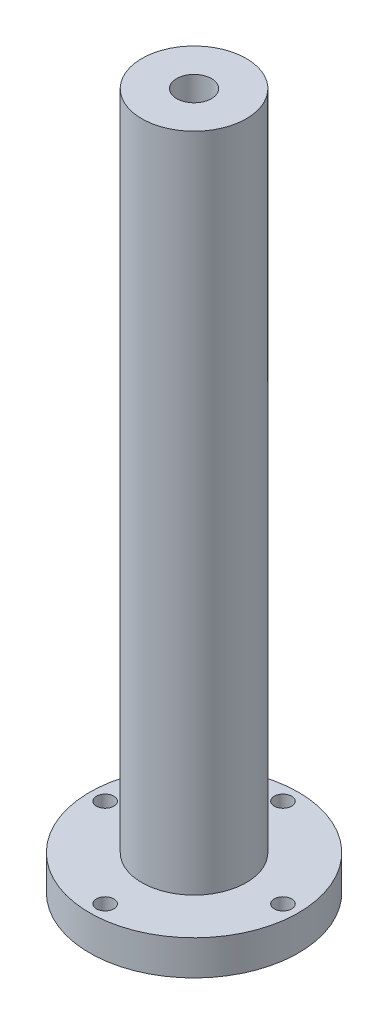
ISO-10303-21;
HEADER;
FILE_DESCRIPTION(('STEP AP214'),'2;1');
FILE_NAME('part.step','',(''),(''),'','','');
FILE_SCHEMA(('AUTOMOTIVE_DESIGN { 1 0 10303 214 1 1 1 1 }'));
ENDSEC;
DATA;
#1=APPLICATION_CONTEXT('core data for automotive mechanical design processes');
#2=APPLICATION_PROTOCOL_DEFINITION('international standard','automotive_design',2000,#1);
#3=PRODUCT_CONTEXT('',#1,'mechanical');
#4=PRODUCT('Part','Part','',(#3));
#5=PRODUCT_RELATED_PRODUCT_CATEGORY('part','',(#4));
#6=PRODUCT_DEFINITION_FORMATION('','',#4);
#7=PRODUCT_DEFINITION_CONTEXT('part definition',#1,'design');
#8=PRODUCT_DEFINITION('design','',#6,#7);
#9=PRODUCT_DEFINITION_SHAPE('','',#8);
#10=(LENGTH_UNIT() NAMED_UNIT(*) SI_UNIT(.MILLI.,.METRE.));
#11=(NAMED_UNIT(*) PLANE_ANGLE_UNIT() SI_UNIT($,.RADIAN.));
#12=(NAMED_UNIT(*) SI_UNIT($,.STERADIAN.) SOLID_ANGLE_UNIT());
#13=UNCERTAINTY_MEASURE_WITH_UNIT(LENGTH_MEASURE(1.E-05),#10,'distance_accuracy_value','');
#14=(GEOMETRIC_REPRESENTATION_CONTEXT(3) GLOBAL_UNCERTAINTY_ASSIGNED_CONTEXT((#13)) GLOBAL_UNIT_ASSIGNED_CONTEXT((#10,
#11,#12)) REPRESENTATION_CONTEXT('',''));
#15=CARTESIAN_POINT('',(0.,0.,0.));
#16=DIRECTION('',(0.,0.,1.));
#17=DIRECTION('',(1.,0.,0.));
#18=AXIS2_PLACEMENT_3D('',#15,#16,#17);
#19=CARTESIAN_POINT('',(0.,245.455794031787,0.));
#20=DIRECTION('',(0.,-1.,0.));
#21=DIRECTION('',(0.,0.,-1.));
#22=AXIS2_PLACEMENT_3D('',#19,#20,#21);
#23=PLANE('',#22);
#24=CARTESIAN_POINT('',(0.,245.455794031787,0.));
#25=DIRECTION('',(0.,-1.,0.));
#26=DIRECTION('',(0.,0.,-1.));
#27=AXIS2_PLACEMENT_3D('',#24,#25,#26);
#28=CIRCLE('',#27,50.);
#29=CARTESIAN_POINT('',(0.,245.455794031787,-50.));
#30=VERTEX_POINT('',#29);
#31=EDGE_CURVE('E54',#30,#30,#28,.T.);
#32=ORIENTED_EDGE('',*,*,#31,.F.);
#33=EDGE_LOOP('',(#32));
#34=FACE_BOUND('',#33,.T.);
#35=ADVANCED_FACE('F32',(#34),#23,.F.);
#36=CARTESIAN_POINT('',(0.,-1654.54420596821,0.));
#37=DIRECTION('',(0.,-1.,0.));
#38=DIRECTION('',(0.,0.,-1.));
#39=AXIS2_PLACEMENT_3D('',#36,#37,#38);
#40=PLANE('',#39);
#41=CARTESIAN_POINT('',(0.,-1654.54420596821,-255.365455534732));
#42=DIRECTION('',(0.,1.,0.));
#43=DIRECTION('',(0.,0.,1.));
#44=AXIS2_PLACEMENT_3D('',#41,#42,#43);
#45=CIRCLE('',#44,25.);
#46=CARTESIAN_POINT('',(0.,-1654.54420596821,-230.365455534732));
#47=VERTEX_POINT('',#46);
#48=EDGE_CURVE('E57',#47,#47,#45,.T.);
#49=ORIENTED_EDGE('',*,*,#48,.T.);
#50=EDGE_LOOP('',(#49));
#51=FACE_BOUND('',#50,.T.);
#52=CARTESIAN_POINT('',(255.365455534739,-1654.54420596821,-7.21101290261088E-12));
#53=DIRECTION('',(0.,1.,0.));
#54=DIRECTION('',(0.,0.,1.));
#55=AXIS2_PLACEMENT_3D('',#52,#53,#54);
#56=CIRCLE('',#55,25.0000000000057);
#57=CARTESIAN_POINT('',(255.365455534739,-1654.54420596821,24.9999999999984));
#58=VERTEX_POINT('',#57);
#59=EDGE_CURVE('E73',#58,#58,#56,.T.);
#60=ORIENTED_EDGE('',*,*,#59,.T.);
#61=EDGE_LOOP('',(#60));
#62=FACE_BOUND('',#61,.T.);
#63=CARTESIAN_POINT('',(1.44220258052218E-11,-1654.54420596821,255.365455534732));
#64=DIRECTION('',(0.,1.,0.));
#65=DIRECTION('',(0.,0.,1.));
#66=AXIS2_PLACEMENT_3D('',#63,#64,#65);
#67=CIRCLE('',#66,25.0000000000155);
#68=CARTESIAN_POINT('',(1.44220258052218E-11,-1654.54420596821,280.365455534747));
#69=VERTEX_POINT('',#68);
#70=EDGE_CURVE('E67',#69,#69,#67,.T.);
#71=ORIENTED_EDGE('',*,*,#70,.T.);
#72=EDGE_LOOP('',(#71));
#73=FACE_BOUND('',#72,.T.);
#74=CARTESIAN_POINT('',(-255.365455534724,-1654.54420596821,7.24228615138422E-12));
#75=DIRECTION('',(0.,1.,0.));
#76=DIRECTION('',(0.,0.,1.));
#77=AXIS2_PLACEMENT_3D('',#74,#75,#76);
#78=CIRCLE('',#77,25.0000000000116);
#79=CARTESIAN_POINT('',(-255.365455534724,-1654.54420596821,25.0000000000188));
#80=VERTEX_POINT('',#79);
#81=EDGE_CURVE('E61',#80,#80,#78,.T.);
#82=ORIENTED_EDGE('',*,*,#81,.T.);
#83=EDGE_LOOP('',(#82));
#84=FACE_BOUND('',#83,.T.);
#85=CARTESIAN_POINT('',(0.,-1654.54420596821,0.));
#86=DIRECTION('',(0.,-1.,0.));
#87=DIRECTION('',(0.,0.,-1.));
#88=AXIS2_PLACEMENT_3D('',#85,#86,#87);
#89=CIRCLE('',#88,300.);
#90=CARTESIAN_POINT('',(0.,-1654.54420596821,-300.));
#91=VERTEX_POINT('',#90);
#92=EDGE_CURVE('E10',#91,#91,#89,.T.);
#93=ORIENTED_EDGE('',*,*,#92,.T.);
#94=EDGE_LOOP('',(#93));
#95=FACE_BOUND('',#94,.T.);
#96=ADVANCED_FACE('F82',(#51,#62,#73,#84,#95),#40,.T.);
#97=CARTESIAN_POINT('',(0.,-1654.54420596821,0.));
#98=DIRECTION('',(0.,-1.,0.));
#99=DIRECTION('',(0.,0.,-1.));
#100=AXIS2_PLACEMENT_3D('',#97,#98,#99);
#101=CYLINDRICAL_SURFACE('',#100,300.);
#102=CARTESIAN_POINT('',(0.,-1554.54420596821,0.));
#103=DIRECTION('',(0.,-1.,0.));
#104=DIRECTION('',(0.,0.,-1.));
#105=AXIS2_PLACEMENT_3D('',#102,#103,#104);
#106=CIRCLE('',#105,300.);
#107=CARTESIAN_POINT('',(0.,-1554.54420596821,-300.));
#108=VERTEX_POINT('',#107);
#109=EDGE_CURVE('E38',#108,#108,#106,.T.);
#110=ORIENTED_EDGE('',*,*,#109,.T.);
#111=EDGE_LOOP('',(#110));
#112=FACE_BOUND('',#111,.T.);
#113=ORIENTED_EDGE('',*,*,#92,.F.);
#114=EDGE_LOOP('',(#113));
#115=FACE_BOUND('',#114,.T.);
#116=ADVANCED_FACE('F96',(#112,#115),#101,.T.);
#117=CARTESIAN_POINT('',(300.,-1554.54420596821,0.));
#118=DIRECTION('',(0.,1.,0.));
#119=DIRECTION('',(0.,0.,1.));
#120=AXIS2_PLACEMENT_3D('',#117,#118,#119);
#121=PLANE('',#120);
#122=CARTESIAN_POINT('',(0.,-1554.54420596821,-255.365455534732));
#123=DIRECTION('',(0.,1.,0.));
#124=DIRECTION('',(0.,0.,1.));
#125=AXIS2_PLACEMENT_3D('',#122,#123,#124);
#126=CIRCLE('',#125,25.);
#127=CARTESIAN_POINT('',(0.,-1554.54420596821,-230.365455534732));
#128=VERTEX_POINT('',#127);
#129=EDGE_CURVE('E76',#128,#128,#126,.T.);
#130=ORIENTED_EDGE('',*,*,#129,.F.);
#131=EDGE_LOOP('',(#130));
#132=FACE_BOUND('',#131,.T.);
#133=CARTESIAN_POINT('',(255.365455534739,-1554.54420596821,-7.21101290261088E-12));
#134=DIRECTION('',(0.,1.,0.));
#135=DIRECTION('',(0.,0.,1.));
#136=AXIS2_PLACEMENT_3D('',#133,#134,#135);
#137=CIRCLE('',#136,25.0000000000057);
#138=CARTESIAN_POINT('',(255.365455534739,-1554.54420596821,24.9999999999984));
#139=VERTEX_POINT('',#138);
#140=EDGE_CURVE('E70',#139,#139,#137,.T.);
#141=ORIENTED_EDGE('',*,*,#140,.F.);
#142=EDGE_LOOP('',(#141));
#143=FACE_BOUND('',#142,.T.);
#144=CARTESIAN_POINT('',(1.44220258052218E-11,-1554.54420596821,255.365455534732));
#145=DIRECTION('',(0.,1.,0.));
#146=DIRECTION('',(0.,0.,1.));
#147=AXIS2_PLACEMENT_3D('',#144,#145,#146);
#148=CIRCLE('',#147,25.0000000000155);
#149=CARTESIAN_POINT('',(1.44220258052218E-11,-1554.54420596821,280.365455534747));
#150=VERTEX_POINT('',#149);
#151=EDGE_CURVE('E64',#150,#150,#148,.T.);
#152=ORIENTED_EDGE('',*,*,#151,.F.);
#153=EDGE_LOOP('',(#152));
#154=FACE_BOUND('',#153,.T.);
#155=CARTESIAN_POINT('',(-255.365455534724,-1554.54420596821,7.24228615138422E-12));
#156=DIRECTION('',(0.,1.,0.));
#157=DIRECTION('',(0.,0.,1.));
#158=AXIS2_PLACEMENT_3D('',#155,#156,#157);
#159=CIRCLE('',#158,25.0000000000116);
#160=CARTESIAN_POINT('',(-255.365455534724,-1554.54420596821,25.0000000000188));
#161=VERTEX_POINT('',#160);
#162=EDGE_CURVE('E58',#161,#161,#159,.T.);
#163=ORIENTED_EDGE('',*,*,#162,.F.);
#164=EDGE_LOOP('',(#163));
#165=FACE_BOUND('',#164,.T.);
#166=CARTESIAN_POINT('',(0.,-1554.54420596821,0.));
#167=DIRECTION('',(0.,-1.,0.));
#168=DIRECTION('',(0.,0.,-1.));
#169=AXIS2_PLACEMENT_3D('',#166,#167,#168);
#170=CIRCLE('',#169,150.);
#171=CARTESIAN_POINT('',(0.,-1554.54420596821,-150.));
#172=VERTEX_POINT('',#171);
#173=EDGE_CURVE('E42',#172,#172,#170,.T.);
#174=ORIENTED_EDGE('',*,*,#173,.T.);
#175=EDGE_LOOP('',(#174));
#176=FACE_BOUND('',#175,.T.);
#177=ORIENTED_EDGE('',*,*,#109,.F.);
#178=EDGE_LOOP('',(#177));
#179=FACE_BOUND('',#178,.T.);
#180=ADVANCED_FACE('F92',(#132,#143,#154,#165,#176,#179),#121,.T.);
#181=CARTESIAN_POINT('',(0.,-1654.54420596821,0.));
#182=DIRECTION('',(0.,-1.,0.));
#183=DIRECTION('',(0.,0.,-1.));
#184=AXIS2_PLACEMENT_3D('',#181,#182,#183);
#185=CYLINDRICAL_SURFACE('',#184,150.);
#186=CARTESIAN_POINT('',(0.,345.455794031787,0.));
#187=DIRECTION('',(0.,-1.,0.));
#188=DIRECTION('',(0.,0.,-1.));
#189=AXIS2_PLACEMENT_3D('',#186,#187,#188);
#190=CIRCLE('',#189,150.);
#191=CARTESIAN_POINT('',(0.,345.455794031787,-150.));
#192=VERTEX_POINT('',#191);
#193=EDGE_CURVE('E46',#192,#192,#190,.T.);
#194=ORIENTED_EDGE('',*,*,#193,.T.);
#195=EDGE_LOOP('',(#194));
#196=FACE_BOUND('',#195,.T.);
#197=ORIENTED_EDGE('',*,*,#173,.F.);
#198=EDGE_LOOP('',(#197));
#199=FACE_BOUND('',#198,.T.);
#200=ADVANCED_FACE('F95',(#196,#199),#185,.T.);
#201=CARTESIAN_POINT('',(150.,345.455794031787,0.));
#202=DIRECTION('',(0.,1.,0.));
#203=DIRECTION('',(0.,0.,1.));
#204=AXIS2_PLACEMENT_3D('',#201,#202,#203);
#205=PLANE('',#204);
#206=CARTESIAN_POINT('',(0.,345.455794031787,0.));
#207=DIRECTION('',(0.,-1.,0.));
#208=DIRECTION('',(0.,0.,-1.));
#209=AXIS2_PLACEMENT_3D('',#206,#207,#208);
#210=CIRCLE('',#209,50.);
#211=CARTESIAN_POINT('',(0.,345.455794031787,-50.));
#212=VERTEX_POINT('',#211);
#213=EDGE_CURVE('E51',#212,#212,#210,.T.);
#214=ORIENTED_EDGE('',*,*,#213,.T.);
#215=EDGE_LOOP('',(#214));
#216=FACE_BOUND('',#215,.T.);
#217=ORIENTED_EDGE('',*,*,#193,.F.);
#218=EDGE_LOOP('',(#217));
#219=FACE_BOUND('',#218,.T.);
#220=ADVANCED_FACE('F108',(#216,#219),#205,.T.);
#221=CARTESIAN_POINT('',(0.,-1654.54420596821,0.));
#222=DIRECTION('',(0.,-1.,0.));
#223=DIRECTION('',(0.,0.,-1.));
#224=AXIS2_PLACEMENT_3D('',#221,#222,#223);
#225=CYLINDRICAL_SURFACE('',#224,50.);
#226=ORIENTED_EDGE('',*,*,#213,.F.);
#227=EDGE_LOOP('',(#226));
#228=FACE_BOUND('',#227,.T.);
#229=ORIENTED_EDGE('',*,*,#31,.T.);
#230=EDGE_LOOP('',(#229));
#231=FACE_BOUND('',#230,.T.);
#232=ADVANCED_FACE('F114',(#228,#231),#225,.F.);
#233=CARTESIAN_POINT('',(-255.365455534724,-1654.54420596821,7.24228615138422E-12));
#234=DIRECTION('',(0.,1.,0.));
#235=DIRECTION('',(0.,0.,1.));
#236=AXIS2_PLACEMENT_3D('',#233,#234,#235);
#237=CYLINDRICAL_SURFACE('',#236,25.0000000000116);
#238=ORIENTED_EDGE('',*,*,#81,.F.);
#239=EDGE_LOOP('',(#238));
#240=FACE_BOUND('',#239,.T.);
#241=ORIENTED_EDGE('',*,*,#162,.T.);
#242=EDGE_LOOP('',(#241));
#243=FACE_BOUND('',#242,.T.);
#244=ADVANCED_FACE('F125',(#240,#243),#237,.F.);
#245=CARTESIAN_POINT('',(1.44220258052218E-11,-1654.54420596821,255.365455534732));
#246=DIRECTION('',(0.,1.,0.));
#247=DIRECTION('',(0.,0.,1.));
#248=AXIS2_PLACEMENT_3D('',#245,#246,#247);
#249=CYLINDRICAL_SURFACE('',#248,25.0000000000155);
#250=ORIENTED_EDGE('',*,*,#70,.F.);
#251=EDGE_LOOP('',(#250));
#252=FACE_BOUND('',#251,.T.);
#253=ORIENTED_EDGE('',*,*,#151,.T.);
#254=EDGE_LOOP('',(#253));
#255=FACE_BOUND('',#254,.T.);
#256=ADVANCED_FACE('F131',(#252,#255),#249,.F.);
#257=CARTESIAN_POINT('',(255.365455534739,-1654.54420596821,-7.21101290261088E-12));
#258=DIRECTION('',(0.,1.,0.));
#259=DIRECTION('',(0.,0.,1.));
#260=AXIS2_PLACEMENT_3D('',#257,#258,#259);
#261=CYLINDRICAL_SURFACE('',#260,25.0000000000057);
#262=ORIENTED_EDGE('',*,*,#59,.F.);
#263=EDGE_LOOP('',(#262));
#264=FACE_BOUND('',#263,.T.);
#265=ORIENTED_EDGE('',*,*,#140,.T.);
#266=EDGE_LOOP('',(#265));
#267=FACE_BOUND('',#266,.T.);
#268=ADVANCED_FACE('F88',(#264,#267),#261,.F.);
#269=CARTESIAN_POINT('',(0.,-1654.54420596821,-255.365455534732));
#270=DIRECTION('',(0.,1.,0.));
#271=DIRECTION('',(0.,0.,1.));
#272=AXIS2_PLACEMENT_3D('',#269,#270,#271);
#273=CYLINDRICAL_SURFACE('',#272,25.);
#274=ORIENTED_EDGE('',*,*,#48,.F.);
#275=EDGE_LOOP('',(#274));
#276=FACE_BOUND('',#275,.T.);
#277=ORIENTED_EDGE('',*,*,#129,.T.);
#278=EDGE_LOOP('',(#277));
#279=FACE_BOUND('',#278,.T.);
#280=ADVANCED_FACE('F85',(#276,#279),#273,.F.);
#281=CLOSED_SHELL('',(#35,#96,#116,#180,#200,#220,#232,#244,#256,#268,#280));
#282=MANIFOLD_SOLID_BREP('B2',#281);
#283=ADVANCED_BREP_SHAPE_REPRESENTATION('',(#18,#282),#14);
#284=SHAPE_DEFINITION_REPRESENTATION(#9,#283);
ENDSEC;
END-ISO-10303-21;
